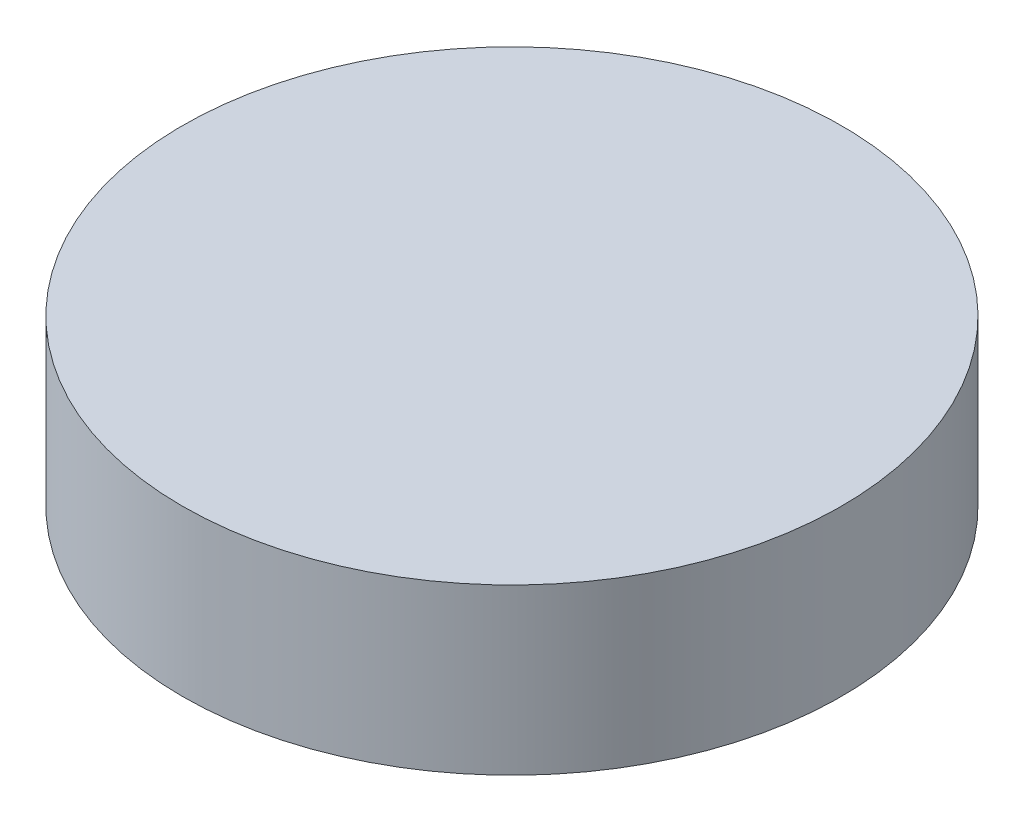
ISO-10303-21;
HEADER;
FILE_DESCRIPTION(('STEP AP214'),'2;1');
FILE_NAME('part.step','',(''),(''),'','','');
FILE_SCHEMA(('AUTOMOTIVE_DESIGN { 1 0 10303 214 1 1 1 1 }'));
ENDSEC;
DATA;
#1=APPLICATION_CONTEXT('core data for automotive mechanical design processes');
#2=APPLICATION_PROTOCOL_DEFINITION('international standard','automotive_design',2000,#1);
#3=PRODUCT_CONTEXT('',#1,'mechanical');
#4=PRODUCT('Part','Part','',(#3));
#5=PRODUCT_RELATED_PRODUCT_CATEGORY('part','',(#4));
#6=PRODUCT_DEFINITION_FORMATION('','',#4);
#7=PRODUCT_DEFINITION_CONTEXT('part definition',#1,'design');
#8=PRODUCT_DEFINITION('design','',#6,#7);
#9=PRODUCT_DEFINITION_SHAPE('','',#8);
#10=(LENGTH_UNIT() NAMED_UNIT(*) SI_UNIT(.MILLI.,.METRE.));
#11=(NAMED_UNIT(*) PLANE_ANGLE_UNIT() SI_UNIT($,.RADIAN.));
#12=(NAMED_UNIT(*) SI_UNIT($,.STERADIAN.) SOLID_ANGLE_UNIT());
#13=UNCERTAINTY_MEASURE_WITH_UNIT(LENGTH_MEASURE(1.E-05),#10,'distance_accuracy_value','');
#14=(GEOMETRIC_REPRESENTATION_CONTEXT(3) GLOBAL_UNCERTAINTY_ASSIGNED_CONTEXT((#13)) GLOBAL_UNIT_ASSIGNED_CONTEXT((#10,
#11,#12)) REPRESENTATION_CONTEXT('',''));
#15=CARTESIAN_POINT('',(0.,0.,0.));
#16=DIRECTION('',(0.,0.,1.));
#17=DIRECTION('',(1.,0.,0.));
#18=AXIS2_PLACEMENT_3D('',#15,#16,#17);
#19=CARTESIAN_POINT('',(0.,0.5,0.));
#20=DIRECTION('',(0.,-1.,0.));
#21=DIRECTION('',(0.,0.,-1.));
#22=AXIS2_PLACEMENT_3D('',#19,#20,#21);
#23=CYLINDRICAL_SURFACE('',#22,1.);
#24=CARTESIAN_POINT('',(0.,0.5,0.));
#25=DIRECTION('',(0.,1.,0.));
#26=DIRECTION('',(0.,0.,1.));
#27=AXIS2_PLACEMENT_3D('',#24,#25,#26);
#28=CIRCLE('',#27,1.);
#29=CARTESIAN_POINT('',(0.,0.5,1.));
#30=VERTEX_POINT('',#29);
#31=EDGE_CURVE('E10',#30,#30,#28,.T.);
#32=ORIENTED_EDGE('',*,*,#31,.F.);
#33=EDGE_LOOP('',(#32));
#34=FACE_BOUND('',#33,.T.);
#35=CARTESIAN_POINT('',(0.,0.,0.));
#36=DIRECTION('',(0.,1.,0.));
#37=DIRECTION('',(0.,0.,1.));
#38=AXIS2_PLACEMENT_3D('',#35,#36,#37);
#39=CIRCLE('',#38,1.);
#40=CARTESIAN_POINT('',(0.,0.,1.));
#41=VERTEX_POINT('',#40);
#42=EDGE_CURVE('E33',#41,#41,#39,.T.);
#43=ORIENTED_EDGE('',*,*,#42,.T.);
#44=EDGE_LOOP('',(#43));
#45=FACE_BOUND('',#44,.T.);
#46=ADVANCED_FACE('F30',(#34,#45),#23,.T.);
#47=CARTESIAN_POINT('',(0.,0.5,0.));
#48=DIRECTION('',(0.,1.,0.));
#49=DIRECTION('',(0.,0.,1.));
#50=AXIS2_PLACEMENT_3D('',#47,#48,#49);
#51=PLANE('',#50);
#52=ORIENTED_EDGE('',*,*,#31,.T.);
#53=EDGE_LOOP('',(#52));
#54=FACE_BOUND('',#53,.T.);
#55=ADVANCED_FACE('F45',(#54),#51,.T.);
#56=CARTESIAN_POINT('',(0.,0.,0.));
#57=DIRECTION('',(0.,1.,0.));
#58=DIRECTION('',(0.,0.,1.));
#59=AXIS2_PLACEMENT_3D('',#56,#57,#58);
#60=PLANE('',#59);
#61=ORIENTED_EDGE('',*,*,#42,.F.);
#62=EDGE_LOOP('',(#61));
#63=FACE_BOUND('',#62,.T.);
#64=ADVANCED_FACE('F43',(#63),#60,.F.);
#65=CLOSED_SHELL('',(#46,#55,#64));
#66=MANIFOLD_SOLID_BREP('B2',#65);
#67=ADVANCED_BREP_SHAPE_REPRESENTATION('',(#18,#66),#14);
#68=SHAPE_DEFINITION_REPRESENTATION(#9,#67);
ENDSEC;
END-ISO-10303-21;
